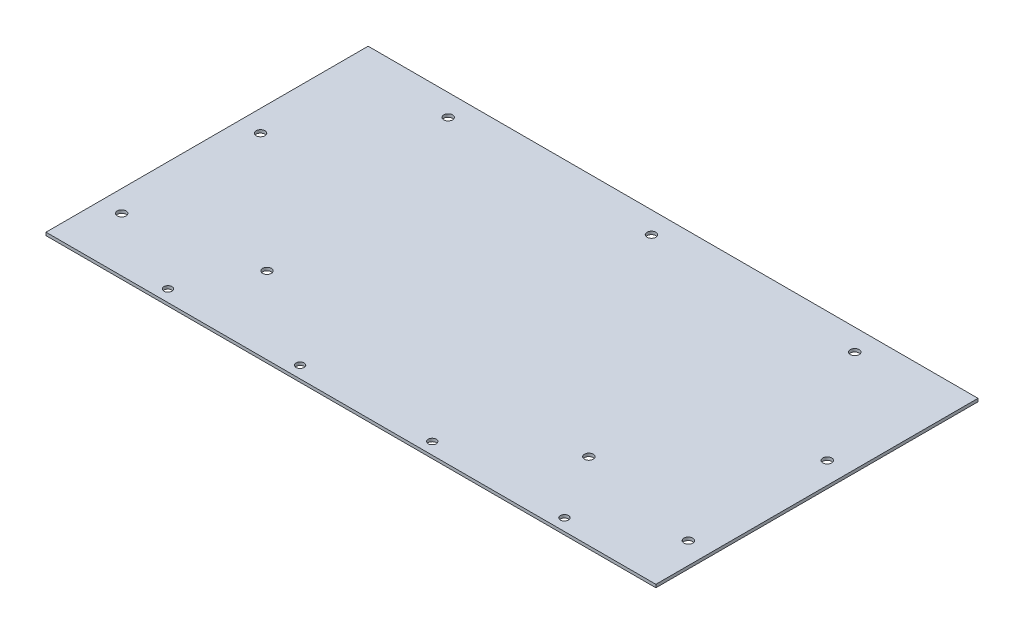
ISO-10303-21;
HEADER;
FILE_DESCRIPTION(('STEP AP214'),'2;1');
FILE_NAME('part.step','',(''),(''),'','','');
FILE_SCHEMA(('AUTOMOTIVE_DESIGN { 1 0 10303 214 1 1 1 1 }'));
ENDSEC;
DATA;
#1=APPLICATION_CONTEXT('core data for automotive mechanical design processes');
#2=APPLICATION_PROTOCOL_DEFINITION('international standard','automotive_design',2000,#1);
#3=PRODUCT_CONTEXT('',#1,'mechanical');
#4=PRODUCT('Part','Part','',(#3));
#5=PRODUCT_RELATED_PRODUCT_CATEGORY('part','',(#4));
#6=PRODUCT_DEFINITION_FORMATION('','',#4);
#7=PRODUCT_DEFINITION_CONTEXT('part definition',#1,'design');
#8=PRODUCT_DEFINITION('design','',#6,#7);
#9=PRODUCT_DEFINITION_SHAPE('','',#8);
#10=(LENGTH_UNIT() NAMED_UNIT(*) SI_UNIT(.MILLI.,.METRE.));
#11=(NAMED_UNIT(*) PLANE_ANGLE_UNIT() SI_UNIT($,.RADIAN.));
#12=(NAMED_UNIT(*) SI_UNIT($,.STERADIAN.) SOLID_ANGLE_UNIT());
#13=UNCERTAINTY_MEASURE_WITH_UNIT(LENGTH_MEASURE(1.E-05),#10,'distance_accuracy_value','');
#14=(GEOMETRIC_REPRESENTATION_CONTEXT(3) GLOBAL_UNCERTAINTY_ASSIGNED_CONTEXT((#13)) GLOBAL_UNIT_ASSIGNED_CONTEXT((#10,
#11,#12)) REPRESENTATION_CONTEXT('',''));
#15=CARTESIAN_POINT('',(0.,0.,0.));
#16=DIRECTION('',(0.,0.,1.));
#17=DIRECTION('',(1.,0.,0.));
#18=AXIS2_PLACEMENT_3D('',#15,#16,#17);
#19=CARTESIAN_POINT('',(-228.6,-1.143,238.315200026));
#20=DIRECTION('',(0.,1.,0.));
#21=DIRECTION('',(0.,0.,1.));
#22=AXIS2_PLACEMENT_3D('',#19,#20,#21);
#23=PLANE('',#22);
#24=CARTESIAN_POINT('',(1.39115855297923E-12,-1.143,13.0175));
#25=DIRECTION('',(0.,-1.,0.));
#26=DIRECTION('',(0.,0.,-1.));
#27=AXIS2_PLACEMENT_3D('',#24,#25,#26);
#28=CIRCLE('',#27,3.3);
#29=CARTESIAN_POINT('',(1.39115855297923E-12,-1.143,9.71749999999999));
#30=VERTEX_POINT('',#29);
#31=EDGE_CURVE('E227',#30,#30,#28,.T.);
#32=ORIENTED_EDGE('',*,*,#31,.F.);
#33=EDGE_LOOP('',(#32));
#34=FACE_BOUND('',#33,.T.);
#35=CARTESIAN_POINT('',(152.400000000001,-1.143,13.0175));
#36=DIRECTION('',(0.,-1.,0.));
#37=DIRECTION('',(0.,0.,-1.));
#38=AXIS2_PLACEMENT_3D('',#35,#36,#37);
#39=CIRCLE('',#38,3.3);
#40=CARTESIAN_POINT('',(152.400000000001,-1.143,9.7175));
#41=VERTEX_POINT('',#40);
#42=EDGE_CURVE('E233',#41,#41,#39,.T.);
#43=ORIENTED_EDGE('',*,*,#42,.F.);
#44=EDGE_LOOP('',(#43));
#45=FACE_BOUND('',#44,.T.);
#46=CARTESIAN_POINT('',(212.419,-1.143,197.784793717392));
#47=DIRECTION('',(0.,-1.,0.));
#48=DIRECTION('',(0.,0.,-1.));
#49=AXIS2_PLACEMENT_3D('',#46,#47,#48);
#50=CIRCLE('',#49,3.3);
#51=CARTESIAN_POINT('',(212.419,-1.143,194.484793717392));
#52=VERTEX_POINT('',#51);
#53=EDGE_CURVE('E245',#52,#52,#50,.T.);
#54=ORIENTED_EDGE('',*,*,#53,.F.);
#55=EDGE_LOOP('',(#54));
#56=FACE_BOUND('',#55,.T.);
#57=CARTESIAN_POINT('',(120.65,-1.143,180.586));
#58=DIRECTION('',(0.,-1.,0.));
#59=DIRECTION('',(0.,0.,-1.));
#60=AXIS2_PLACEMENT_3D('',#57,#58,#59);
#61=CIRCLE('',#60,3.3);
#62=CARTESIAN_POINT('',(120.65,-1.143,177.286));
#63=VERTEX_POINT('',#62);
#64=EDGE_CURVE('E251',#63,#63,#61,.T.);
#65=ORIENTED_EDGE('',*,*,#64,.F.);
#66=EDGE_LOOP('',(#65));
#67=FACE_BOUND('',#66,.T.);
#68=CARTESIAN_POINT('',(-212.419,-1.143,197.784793717392));
#69=DIRECTION('',(0.,-1.,0.));
#70=DIRECTION('',(0.,0.,-1.));
#71=AXIS2_PLACEMENT_3D('',#68,#69,#70);
#72=CIRCLE('',#71,3.3);
#73=CARTESIAN_POINT('',(-212.419,-1.143,194.484793717392));
#74=VERTEX_POINT('',#73);
#75=EDGE_CURVE('E263',#74,#74,#72,.T.);
#76=ORIENTED_EDGE('',*,*,#75,.F.);
#77=EDGE_LOOP('',(#76));
#78=FACE_BOUND('',#77,.T.);
#79=CARTESIAN_POINT('',(-46.99,-1.143,229.425200026));
#80=DIRECTION('',(0.,1.,0.));
#81=DIRECTION('',(0.,0.,1.));
#82=AXIS2_PLACEMENT_3D('',#79,#80,#81);
#83=CIRCLE('',#82,2.99999999999999);
#84=CARTESIAN_POINT('',(-46.99,-1.143,232.425200026));
#85=VERTEX_POINT('',#84);
#86=EDGE_CURVE('E271',#85,#85,#83,.T.);
#87=ORIENTED_EDGE('',*,*,#86,.T.);
#88=EDGE_LOOP('',(#87));
#89=FACE_BOUND('',#88,.T.);
#90=CARTESIAN_POINT('',(-146.05,-1.143,229.425200026));
#91=DIRECTION('',(0.,1.,0.));
#92=DIRECTION('',(0.,0.,1.));
#93=AXIS2_PLACEMENT_3D('',#90,#91,#92);
#94=CIRCLE('',#93,2.99999999999999);
#95=CARTESIAN_POINT('',(-146.05,-1.143,232.425200026));
#96=VERTEX_POINT('',#95);
#97=EDGE_CURVE('E110',#96,#96,#94,.T.);
#98=ORIENTED_EDGE('',*,*,#97,.T.);
#99=EDGE_LOOP('',(#98));
#100=FACE_BOUND('',#99,.T.);
#101=DIRECTION('',(0.,0.,-1.));
#102=VECTOR('',#101,1.);
#103=CARTESIAN_POINT('',(-228.6,-1.143,238.315200026));
#104=LINE('',#103,#102);
#105=CARTESIAN_POINT('',(-228.6,-1.143,238.315200026));
#106=VERTEX_POINT('',#105);
#107=CARTESIAN_POINT('',(-228.6,-1.143,-3.175));
#108=VERTEX_POINT('',#107);
#109=EDGE_CURVE('E126',#106,#108,#104,.T.);
#110=ORIENTED_EDGE('',*,*,#109,.T.);
#111=DIRECTION('',(-1.,0.,0.));
#112=VECTOR('',#111,1.);
#113=CARTESIAN_POINT('',(0.,-1.143,-3.175));
#114=LINE('',#113,#112);
#115=CARTESIAN_POINT('',(228.6,-1.143,-3.175));
#116=VERTEX_POINT('',#115);
#117=EDGE_CURVE('E104',#116,#108,#114,.T.);
#118=ORIENTED_EDGE('',*,*,#117,.F.);
#119=DIRECTION('',(0.,0.,-1.));
#120=VECTOR('',#119,1.);
#121=CARTESIAN_POINT('',(228.6,-1.143,238.315200026));
#122=LINE('',#121,#120);
#123=CARTESIAN_POINT('',(228.6,-1.143,238.315200026));
#124=VERTEX_POINT('',#123);
#125=EDGE_CURVE('E100',#124,#116,#122,.T.);
#126=ORIENTED_EDGE('',*,*,#125,.F.);
#127=DIRECTION('',(1.,0.,0.));
#128=VECTOR('',#127,1.);
#129=CARTESIAN_POINT('',(-228.6,-1.143,238.315200026));
#130=LINE('',#129,#128);
#131=EDGE_CURVE('E58',#106,#124,#130,.T.);
#132=ORIENTED_EDGE('',*,*,#131,.F.);
#133=EDGE_LOOP('',(#110,#118,#126,#132));
#134=FACE_BOUND('',#133,.T.);
#135=CARTESIAN_POINT('',(52.07,-1.143,229.425200026));
#136=DIRECTION('',(0.,1.,0.));
#137=DIRECTION('',(0.,0.,1.));
#138=AXIS2_PLACEMENT_3D('',#135,#136,#137);
#139=CIRCLE('',#138,2.99999999999999);
#140=CARTESIAN_POINT('',(52.07,-1.143,232.425200026));
#141=VERTEX_POINT('',#140);
#142=EDGE_CURVE('E131',#141,#141,#139,.T.);
#143=ORIENTED_EDGE('',*,*,#142,.T.);
#144=EDGE_LOOP('',(#143));
#145=FACE_BOUND('',#144,.T.);
#146=CARTESIAN_POINT('',(151.13,-1.143,229.425200026));
#147=DIRECTION('',(0.,1.,0.));
#148=DIRECTION('',(0.,0.,1.));
#149=AXIS2_PLACEMENT_3D('',#146,#147,#148);
#150=CIRCLE('',#149,2.99999999999999);
#151=CARTESIAN_POINT('',(151.13,-1.143,232.425200026));
#152=VERTEX_POINT('',#151);
#153=EDGE_CURVE('E11',#152,#152,#150,.T.);
#154=ORIENTED_EDGE('',*,*,#153,.T.);
#155=EDGE_LOOP('',(#154));
#156=FACE_BOUND('',#155,.T.);
#157=CARTESIAN_POINT('',(-120.65,-1.143,180.586));
#158=DIRECTION('',(0.,-1.,0.));
#159=DIRECTION('',(0.,0.,-1.));
#160=AXIS2_PLACEMENT_3D('',#157,#158,#159);
#161=CIRCLE('',#160,3.3);
#162=CARTESIAN_POINT('',(-120.65,-1.143,177.286));
#163=VERTEX_POINT('',#162);
#164=EDGE_CURVE('E257',#163,#163,#161,.T.);
#165=ORIENTED_EDGE('',*,*,#164,.F.);
#166=EDGE_LOOP('',(#165));
#167=FACE_BOUND('',#166,.T.);
#168=CARTESIAN_POINT('',(212.419,-1.143,93.6447937173916));
#169=DIRECTION('',(0.,-1.,0.));
#170=DIRECTION('',(0.,0.,-1.));
#171=AXIS2_PLACEMENT_3D('',#168,#169,#170);
#172=CIRCLE('',#171,3.3);
#173=CARTESIAN_POINT('',(212.419,-1.143,90.3447937173916));
#174=VERTEX_POINT('',#173);
#175=EDGE_CURVE('E239',#174,#174,#172,.T.);
#176=ORIENTED_EDGE('',*,*,#175,.F.);
#177=EDGE_LOOP('',(#176));
#178=FACE_BOUND('',#177,.T.);
#179=CARTESIAN_POINT('',(-152.399999999999,-1.143,13.0175));
#180=DIRECTION('',(0.,-1.,0.));
#181=DIRECTION('',(0.,0.,-1.));
#182=AXIS2_PLACEMENT_3D('',#179,#180,#181);
#183=CIRCLE('',#182,3.3);
#184=CARTESIAN_POINT('',(-152.399999999999,-1.143,9.7175));
#185=VERTEX_POINT('',#184);
#186=EDGE_CURVE('E219',#185,#185,#183,.T.);
#187=ORIENTED_EDGE('',*,*,#186,.F.);
#188=EDGE_LOOP('',(#187));
#189=FACE_BOUND('',#188,.T.);
#190=CARTESIAN_POINT('',(-212.419,-1.143,93.6447937173916));
#191=DIRECTION('',(0.,-1.,0.));
#192=DIRECTION('',(0.,0.,-1.));
#193=AXIS2_PLACEMENT_3D('',#190,#191,#192);
#194=CIRCLE('',#193,3.3);
#195=CARTESIAN_POINT('',(-212.419,-1.143,90.3447937173916));
#196=VERTEX_POINT('',#195);
#197=EDGE_CURVE('E216',#196,#196,#194,.T.);
#198=ORIENTED_EDGE('',*,*,#197,.F.);
#199=EDGE_LOOP('',(#198));
#200=FACE_BOUND('',#199,.T.);
#201=ADVANCED_FACE('F43',(#34,#45,#56,#67,#78,#89,#100,#134,#145,#156,#167,#178,#189,#200),#23,.F.);
#202=CARTESIAN_POINT('',(151.13,-1.397,229.425200026));
#203=DIRECTION('',(0.,1.,0.));
#204=DIRECTION('',(0.,0.,1.));
#205=AXIS2_PLACEMENT_3D('',#202,#203,#204);
#206=CYLINDRICAL_SURFACE('',#205,2.99999999999999);
#207=CARTESIAN_POINT('',(151.13,1.143,229.425200026));
#208=DIRECTION('',(0.,1.,0.));
#209=DIRECTION('',(0.,0.,1.));
#210=AXIS2_PLACEMENT_3D('',#207,#208,#209);
#211=CIRCLE('',#210,2.99999999999999);
#212=CARTESIAN_POINT('',(151.13,1.143,232.425200026));
#213=VERTEX_POINT('',#212);
#214=EDGE_CURVE('E51',#213,#213,#211,.T.);
#215=ORIENTED_EDGE('',*,*,#214,.T.);
#216=EDGE_LOOP('',(#215));
#217=FACE_BOUND('',#216,.T.);
#218=ORIENTED_EDGE('',*,*,#153,.F.);
#219=EDGE_LOOP('',(#218));
#220=FACE_BOUND('',#219,.T.);
#221=ADVANCED_FACE('F45',(#217,#220),#206,.F.);
#222=CARTESIAN_POINT('',(52.07,-1.397,229.425200026));
#223=DIRECTION('',(0.,1.,0.));
#224=DIRECTION('',(0.,0.,1.));
#225=AXIS2_PLACEMENT_3D('',#222,#223,#224);
#226=CYLINDRICAL_SURFACE('',#225,2.99999999999999);
#227=CARTESIAN_POINT('',(52.07,1.143,229.425200026));
#228=DIRECTION('',(0.,1.,0.));
#229=DIRECTION('',(0.,0.,1.));
#230=AXIS2_PLACEMENT_3D('',#227,#228,#229);
#231=CIRCLE('',#230,2.99999999999999);
#232=CARTESIAN_POINT('',(52.07,1.143,232.425200026));
#233=VERTEX_POINT('',#232);
#234=EDGE_CURVE('E94',#233,#233,#231,.T.);
#235=ORIENTED_EDGE('',*,*,#234,.T.);
#236=EDGE_LOOP('',(#235));
#237=FACE_BOUND('',#236,.T.);
#238=ORIENTED_EDGE('',*,*,#142,.F.);
#239=EDGE_LOOP('',(#238));
#240=FACE_BOUND('',#239,.T.);
#241=ADVANCED_FACE('F151',(#237,#240),#226,.F.);
#242=CARTESIAN_POINT('',(228.6,-1.143,238.315200026));
#243=DIRECTION('',(-1.,0.,0.));
#244=DIRECTION('',(0.,0.,1.));
#245=AXIS2_PLACEMENT_3D('',#242,#243,#244);
#246=PLANE('',#245);
#247=ORIENTED_EDGE('',*,*,#125,.T.);
#248=DIRECTION('',(0.,-1.,0.));
#249=VECTOR('',#248,1.);
#250=CARTESIAN_POINT('',(228.6,0.,-3.175));
#251=LINE('',#250,#249);
#252=CARTESIAN_POINT('',(228.6,1.143,-3.175));
#253=VERTEX_POINT('',#252);
#254=EDGE_CURVE('E98',#253,#116,#251,.T.);
#255=ORIENTED_EDGE('',*,*,#254,.F.);
#256=DIRECTION('',(0.,0.,-1.));
#257=VECTOR('',#256,1.);
#258=CARTESIAN_POINT('',(228.6,1.143,238.315200026));
#259=LINE('',#258,#257);
#260=CARTESIAN_POINT('',(228.6,1.143,238.315200026));
#261=VERTEX_POINT('',#260);
#262=EDGE_CURVE('E84',#261,#253,#259,.T.);
#263=ORIENTED_EDGE('',*,*,#262,.F.);
#264=DIRECTION('',(0.,1.,0.));
#265=VECTOR('',#264,1.);
#266=CARTESIAN_POINT('',(228.6,-1.143,238.315200026));
#267=LINE('',#266,#265);
#268=EDGE_CURVE('E120',#124,#261,#267,.T.);
#269=ORIENTED_EDGE('',*,*,#268,.F.);
#270=EDGE_LOOP('',(#247,#255,#263,#269));
#271=FACE_BOUND('',#270,.T.);
#272=ADVANCED_FACE('F99',(#271),#246,.F.);
#273=CARTESIAN_POINT('',(-228.6,1.143,238.315200026));
#274=DIRECTION('',(0.,-1.,0.));
#275=DIRECTION('',(0.,0.,-1.));
#276=AXIS2_PLACEMENT_3D('',#273,#274,#275);
#277=PLANE('',#276);
#278=CARTESIAN_POINT('',(-212.419,1.143,93.6447937173916));
#279=DIRECTION('',(0.,-1.,0.));
#280=DIRECTION('',(0.,0.,-1.));
#281=AXIS2_PLACEMENT_3D('',#278,#279,#280);
#282=CIRCLE('',#281,3.3);
#283=CARTESIAN_POINT('',(-212.419,1.143,90.3447937173916));
#284=VERTEX_POINT('',#283);
#285=EDGE_CURVE('E213',#284,#284,#282,.T.);
#286=ORIENTED_EDGE('',*,*,#285,.T.);
#287=EDGE_LOOP('',(#286));
#288=FACE_BOUND('',#287,.T.);
#289=CARTESIAN_POINT('',(-152.399999999999,1.143,13.0175));
#290=DIRECTION('',(0.,-1.,0.));
#291=DIRECTION('',(0.,0.,-1.));
#292=AXIS2_PLACEMENT_3D('',#289,#290,#291);
#293=CIRCLE('',#292,3.3);
#294=CARTESIAN_POINT('',(-152.399999999999,1.143,9.7175));
#295=VERTEX_POINT('',#294);
#296=EDGE_CURVE('E224',#295,#295,#293,.T.);
#297=ORIENTED_EDGE('',*,*,#296,.T.);
#298=EDGE_LOOP('',(#297));
#299=FACE_BOUND('',#298,.T.);
#300=CARTESIAN_POINT('',(1.39115855297923E-12,1.143,13.0175));
#301=DIRECTION('',(0.,-1.,0.));
#302=DIRECTION('',(0.,0.,-1.));
#303=AXIS2_PLACEMENT_3D('',#300,#301,#302);
#304=CIRCLE('',#303,3.3);
#305=CARTESIAN_POINT('',(1.39115855297923E-12,1.143,9.71749999999999));
#306=VERTEX_POINT('',#305);
#307=EDGE_CURVE('E230',#306,#306,#304,.T.);
#308=ORIENTED_EDGE('',*,*,#307,.T.);
#309=EDGE_LOOP('',(#308));
#310=FACE_BOUND('',#309,.T.);
#311=CARTESIAN_POINT('',(152.400000000001,1.143,13.0175));
#312=DIRECTION('',(0.,-1.,0.));
#313=DIRECTION('',(0.,0.,-1.));
#314=AXIS2_PLACEMENT_3D('',#311,#312,#313);
#315=CIRCLE('',#314,3.3);
#316=CARTESIAN_POINT('',(152.400000000001,1.143,9.7175));
#317=VERTEX_POINT('',#316);
#318=EDGE_CURVE('E236',#317,#317,#315,.T.);
#319=ORIENTED_EDGE('',*,*,#318,.T.);
#320=EDGE_LOOP('',(#319));
#321=FACE_BOUND('',#320,.T.);
#322=CARTESIAN_POINT('',(212.419,1.143,93.6447937173916));
#323=DIRECTION('',(0.,-1.,0.));
#324=DIRECTION('',(0.,0.,-1.));
#325=AXIS2_PLACEMENT_3D('',#322,#323,#324);
#326=CIRCLE('',#325,3.3);
#327=CARTESIAN_POINT('',(212.419,1.143,90.3447937173916));
#328=VERTEX_POINT('',#327);
#329=EDGE_CURVE('E242',#328,#328,#326,.T.);
#330=ORIENTED_EDGE('',*,*,#329,.T.);
#331=EDGE_LOOP('',(#330));
#332=FACE_BOUND('',#331,.T.);
#333=CARTESIAN_POINT('',(212.419,1.143,197.784793717392));
#334=DIRECTION('',(0.,-1.,0.));
#335=DIRECTION('',(0.,0.,-1.));
#336=AXIS2_PLACEMENT_3D('',#333,#334,#335);
#337=CIRCLE('',#336,3.3);
#338=CARTESIAN_POINT('',(212.419,1.143,194.484793717392));
#339=VERTEX_POINT('',#338);
#340=EDGE_CURVE('E248',#339,#339,#337,.T.);
#341=ORIENTED_EDGE('',*,*,#340,.T.);
#342=EDGE_LOOP('',(#341));
#343=FACE_BOUND('',#342,.T.);
#344=CARTESIAN_POINT('',(120.65,1.143,180.586));
#345=DIRECTION('',(0.,-1.,0.));
#346=DIRECTION('',(0.,0.,-1.));
#347=AXIS2_PLACEMENT_3D('',#344,#345,#346);
#348=CIRCLE('',#347,3.3);
#349=CARTESIAN_POINT('',(120.65,1.143,177.286));
#350=VERTEX_POINT('',#349);
#351=EDGE_CURVE('E254',#350,#350,#348,.T.);
#352=ORIENTED_EDGE('',*,*,#351,.T.);
#353=EDGE_LOOP('',(#352));
#354=FACE_BOUND('',#353,.T.);
#355=CARTESIAN_POINT('',(-120.65,1.143,180.586));
#356=DIRECTION('',(0.,-1.,0.));
#357=DIRECTION('',(0.,0.,-1.));
#358=AXIS2_PLACEMENT_3D('',#355,#356,#357);
#359=CIRCLE('',#358,3.3);
#360=CARTESIAN_POINT('',(-120.65,1.143,177.286));
#361=VERTEX_POINT('',#360);
#362=EDGE_CURVE('E260',#361,#361,#359,.T.);
#363=ORIENTED_EDGE('',*,*,#362,.T.);
#364=EDGE_LOOP('',(#363));
#365=FACE_BOUND('',#364,.T.);
#366=CARTESIAN_POINT('',(-212.419,1.143,197.784793717392));
#367=DIRECTION('',(0.,-1.,0.));
#368=DIRECTION('',(0.,0.,-1.));
#369=AXIS2_PLACEMENT_3D('',#366,#367,#368);
#370=CIRCLE('',#369,3.3);
#371=CARTESIAN_POINT('',(-212.419,1.143,194.484793717392));
#372=VERTEX_POINT('',#371);
#373=EDGE_CURVE('E266',#372,#372,#370,.T.);
#374=ORIENTED_EDGE('',*,*,#373,.T.);
#375=EDGE_LOOP('',(#374));
#376=FACE_BOUND('',#375,.T.);
#377=CARTESIAN_POINT('',(-46.99,1.143,229.425200026));
#378=DIRECTION('',(0.,1.,0.));
#379=DIRECTION('',(0.,0.,1.));
#380=AXIS2_PLACEMENT_3D('',#377,#378,#379);
#381=CIRCLE('',#380,2.99999999999999);
#382=CARTESIAN_POINT('',(-46.99,1.143,232.425200026));
#383=VERTEX_POINT('',#382);
#384=EDGE_CURVE('E269',#383,#383,#381,.T.);
#385=ORIENTED_EDGE('',*,*,#384,.F.);
#386=EDGE_LOOP('',(#385));
#387=FACE_BOUND('',#386,.T.);
#388=CARTESIAN_POINT('',(-146.05,1.143,229.425200026));
#389=DIRECTION('',(0.,1.,0.));
#390=DIRECTION('',(0.,0.,1.));
#391=AXIS2_PLACEMENT_3D('',#388,#389,#390);
#392=CIRCLE('',#391,2.99999999999999);
#393=CARTESIAN_POINT('',(-146.05,1.143,232.425200026));
#394=VERTEX_POINT('',#393);
#395=EDGE_CURVE('E113',#394,#394,#392,.T.);
#396=ORIENTED_EDGE('',*,*,#395,.F.);
#397=EDGE_LOOP('',(#396));
#398=FACE_BOUND('',#397,.T.);
#399=ORIENTED_EDGE('',*,*,#262,.T.);
#400=DIRECTION('',(1.,0.,0.));
#401=VECTOR('',#400,1.);
#402=CARTESIAN_POINT('',(0.,1.143,-3.175));
#403=LINE('',#402,#401);
#404=CARTESIAN_POINT('',(-228.6,1.143,-3.175));
#405=VERTEX_POINT('',#404);
#406=EDGE_CURVE('E90',#405,#253,#403,.T.);
#407=ORIENTED_EDGE('',*,*,#406,.F.);
#408=DIRECTION('',(0.,0.,-1.));
#409=VECTOR('',#408,1.);
#410=CARTESIAN_POINT('',(-228.6,1.143,238.315200026));
#411=LINE('',#410,#409);
#412=CARTESIAN_POINT('',(-228.6,1.143,238.315200026));
#413=VERTEX_POINT('',#412);
#414=EDGE_CURVE('E95',#413,#405,#411,.T.);
#415=ORIENTED_EDGE('',*,*,#414,.F.);
#416=DIRECTION('',(-1.,0.,0.));
#417=VECTOR('',#416,1.);
#418=CARTESIAN_POINT('',(-228.6,1.143,238.315200026));
#419=LINE('',#418,#417);
#420=EDGE_CURVE('E91',#261,#413,#419,.T.);
#421=ORIENTED_EDGE('',*,*,#420,.F.);
#422=EDGE_LOOP('',(#399,#407,#415,#421));
#423=FACE_BOUND('',#422,.T.);
#424=ORIENTED_EDGE('',*,*,#234,.F.);
#425=EDGE_LOOP('',(#424));
#426=FACE_BOUND('',#425,.T.);
#427=ORIENTED_EDGE('',*,*,#214,.F.);
#428=EDGE_LOOP('',(#427));
#429=FACE_BOUND('',#428,.T.);
#430=ADVANCED_FACE('F86',(#288,#299,#310,#321,#332,#343,#354,#365,#376,#387,#398,#423,#426,
#429),#277,.F.);
#431=CARTESIAN_POINT('',(-228.6,-1.143,238.315200026));
#432=DIRECTION('',(1.,0.,0.));
#433=DIRECTION('',(0.,0.,-1.));
#434=AXIS2_PLACEMENT_3D('',#431,#432,#433);
#435=PLANE('',#434);
#436=ORIENTED_EDGE('',*,*,#414,.T.);
#437=DIRECTION('',(0.,1.,0.));
#438=VECTOR('',#437,1.);
#439=CARTESIAN_POINT('',(-228.6,0.,-3.175));
#440=LINE('',#439,#438);
#441=EDGE_CURVE('E109',#108,#405,#440,.T.);
#442=ORIENTED_EDGE('',*,*,#441,.F.);
#443=ORIENTED_EDGE('',*,*,#109,.F.);
#444=DIRECTION('',(0.,-1.,0.));
#445=VECTOR('',#444,1.);
#446=CARTESIAN_POINT('',(-228.6,-1.143,238.315200026));
#447=LINE('',#446,#445);
#448=EDGE_CURVE('E63',#413,#106,#447,.T.);
#449=ORIENTED_EDGE('',*,*,#448,.F.);
#450=EDGE_LOOP('',(#436,#442,#443,#449));
#451=FACE_BOUND('',#450,.T.);
#452=ADVANCED_FACE('F139',(#451),#435,.F.);
#453=CARTESIAN_POINT('',(0.,0.,238.315200026));
#454=DIRECTION('',(0.,0.,-1.));
#455=DIRECTION('',(-1.,0.,0.));
#456=AXIS2_PLACEMENT_3D('',#453,#454,#455);
#457=PLANE('',#456);
#458=ORIENTED_EDGE('',*,*,#268,.T.);
#459=ORIENTED_EDGE('',*,*,#420,.T.);
#460=ORIENTED_EDGE('',*,*,#448,.T.);
#461=ORIENTED_EDGE('',*,*,#131,.T.);
#462=EDGE_LOOP('',(#458,#459,#460,#461));
#463=FACE_BOUND('',#462,.T.);
#464=ADVANCED_FACE('F147',(#463),#457,.F.);
#465=CARTESIAN_POINT('',(0.,0.,-3.175));
#466=DIRECTION('',(0.,0.,-1.));
#467=DIRECTION('',(-1.,0.,0.));
#468=AXIS2_PLACEMENT_3D('',#465,#466,#467);
#469=PLANE('',#468);
#470=ORIENTED_EDGE('',*,*,#406,.T.);
#471=ORIENTED_EDGE('',*,*,#254,.T.);
#472=ORIENTED_EDGE('',*,*,#117,.T.);
#473=ORIENTED_EDGE('',*,*,#441,.T.);
#474=EDGE_LOOP('',(#470,#471,#472,#473));
#475=FACE_BOUND('',#474,.T.);
#476=ADVANCED_FACE('F107',(#475),#469,.T.);
#477=CARTESIAN_POINT('',(-146.05,-1.397,229.425200026));
#478=DIRECTION('',(0.,1.,0.));
#479=DIRECTION('',(0.,0.,1.));
#480=AXIS2_PLACEMENT_3D('',#477,#478,#479);
#481=CYLINDRICAL_SURFACE('',#480,2.99999999999999);
#482=ORIENTED_EDGE('',*,*,#395,.T.);
#483=EDGE_LOOP('',(#482));
#484=FACE_BOUND('',#483,.T.);
#485=ORIENTED_EDGE('',*,*,#97,.F.);
#486=EDGE_LOOP('',(#485));
#487=FACE_BOUND('',#486,.T.);
#488=ADVANCED_FACE('F168',(#484,#487),#481,.F.);
#489=CARTESIAN_POINT('',(-46.99,-1.397,229.425200026));
#490=DIRECTION('',(0.,1.,0.));
#491=DIRECTION('',(0.,0.,1.));
#492=AXIS2_PLACEMENT_3D('',#489,#490,#491);
#493=CYLINDRICAL_SURFACE('',#492,2.99999999999999);
#494=ORIENTED_EDGE('',*,*,#384,.T.);
#495=EDGE_LOOP('',(#494));
#496=FACE_BOUND('',#495,.T.);
#497=ORIENTED_EDGE('',*,*,#86,.F.);
#498=EDGE_LOOP('',(#497));
#499=FACE_BOUND('',#498,.T.);
#500=ADVANCED_FACE('F171',(#496,#499),#493,.F.);
#501=CARTESIAN_POINT('',(-212.419,-1.143,197.784793717392));
#502=DIRECTION('',(0.,-1.,0.));
#503=DIRECTION('',(0.,0.,-1.));
#504=AXIS2_PLACEMENT_3D('',#501,#502,#503);
#505=CYLINDRICAL_SURFACE('',#504,3.3);
#506=ORIENTED_EDGE('',*,*,#373,.F.);
#507=EDGE_LOOP('',(#506));
#508=FACE_BOUND('',#507,.T.);
#509=ORIENTED_EDGE('',*,*,#75,.T.);
#510=EDGE_LOOP('',(#509));
#511=FACE_BOUND('',#510,.T.);
#512=ADVANCED_FACE('F174',(#508,#511),#505,.F.);
#513=CARTESIAN_POINT('',(-120.65,-1.143,180.586));
#514=DIRECTION('',(0.,-1.,0.));
#515=DIRECTION('',(0.,0.,-1.));
#516=AXIS2_PLACEMENT_3D('',#513,#514,#515);
#517=CYLINDRICAL_SURFACE('',#516,3.3);
#518=ORIENTED_EDGE('',*,*,#362,.F.);
#519=EDGE_LOOP('',(#518));
#520=FACE_BOUND('',#519,.T.);
#521=ORIENTED_EDGE('',*,*,#164,.T.);
#522=EDGE_LOOP('',(#521));
#523=FACE_BOUND('',#522,.T.);
#524=ADVANCED_FACE('F177',(#520,#523),#517,.F.);
#525=CARTESIAN_POINT('',(120.65,-1.143,180.586));
#526=DIRECTION('',(0.,-1.,0.));
#527=DIRECTION('',(0.,0.,-1.));
#528=AXIS2_PLACEMENT_3D('',#525,#526,#527);
#529=CYLINDRICAL_SURFACE('',#528,3.3);
#530=ORIENTED_EDGE('',*,*,#351,.F.);
#531=EDGE_LOOP('',(#530));
#532=FACE_BOUND('',#531,.T.);
#533=ORIENTED_EDGE('',*,*,#64,.T.);
#534=EDGE_LOOP('',(#533));
#535=FACE_BOUND('',#534,.T.);
#536=ADVANCED_FACE('F181',(#532,#535),#529,.F.);
#537=CARTESIAN_POINT('',(212.419,-1.143,197.784793717392));
#538=DIRECTION('',(0.,-1.,0.));
#539=DIRECTION('',(0.,0.,-1.));
#540=AXIS2_PLACEMENT_3D('',#537,#538,#539);
#541=CYLINDRICAL_SURFACE('',#540,3.3);
#542=ORIENTED_EDGE('',*,*,#340,.F.);
#543=EDGE_LOOP('',(#542));
#544=FACE_BOUND('',#543,.T.);
#545=ORIENTED_EDGE('',*,*,#53,.T.);
#546=EDGE_LOOP('',(#545));
#547=FACE_BOUND('',#546,.T.);
#548=ADVANCED_FACE('F185',(#544,#547),#541,.F.);
#549=CARTESIAN_POINT('',(212.419,-1.143,93.6447937173916));
#550=DIRECTION('',(0.,-1.,0.));
#551=DIRECTION('',(0.,0.,-1.));
#552=AXIS2_PLACEMENT_3D('',#549,#550,#551);
#553=CYLINDRICAL_SURFACE('',#552,3.3);
#554=ORIENTED_EDGE('',*,*,#329,.F.);
#555=EDGE_LOOP('',(#554));
#556=FACE_BOUND('',#555,.T.);
#557=ORIENTED_EDGE('',*,*,#175,.T.);
#558=EDGE_LOOP('',(#557));
#559=FACE_BOUND('',#558,.T.);
#560=ADVANCED_FACE('F189',(#556,#559),#553,.F.);
#561=CARTESIAN_POINT('',(152.400000000001,-1.143,13.0175));
#562=DIRECTION('',(0.,-1.,0.));
#563=DIRECTION('',(0.,0.,-1.));
#564=AXIS2_PLACEMENT_3D('',#561,#562,#563);
#565=CYLINDRICAL_SURFACE('',#564,3.3);
#566=ORIENTED_EDGE('',*,*,#318,.F.);
#567=EDGE_LOOP('',(#566));
#568=FACE_BOUND('',#567,.T.);
#569=ORIENTED_EDGE('',*,*,#42,.T.);
#570=EDGE_LOOP('',(#569));
#571=FACE_BOUND('',#570,.T.);
#572=ADVANCED_FACE('F193',(#568,#571),#565,.F.);
#573=CARTESIAN_POINT('',(1.39115855297923E-12,-1.143,13.0175));
#574=DIRECTION('',(0.,-1.,0.));
#575=DIRECTION('',(0.,0.,-1.));
#576=AXIS2_PLACEMENT_3D('',#573,#574,#575);
#577=CYLINDRICAL_SURFACE('',#576,3.3);
#578=ORIENTED_EDGE('',*,*,#307,.F.);
#579=EDGE_LOOP('',(#578));
#580=FACE_BOUND('',#579,.T.);
#581=ORIENTED_EDGE('',*,*,#31,.T.);
#582=EDGE_LOOP('',(#581));
#583=FACE_BOUND('',#582,.T.);
#584=ADVANCED_FACE('F197',(#580,#583),#577,.F.);
#585=CARTESIAN_POINT('',(-152.399999999999,-1.143,13.0175));
#586=DIRECTION('',(0.,-1.,0.));
#587=DIRECTION('',(0.,0.,-1.));
#588=AXIS2_PLACEMENT_3D('',#585,#586,#587);
#589=CYLINDRICAL_SURFACE('',#588,3.3);
#590=ORIENTED_EDGE('',*,*,#296,.F.);
#591=EDGE_LOOP('',(#590));
#592=FACE_BOUND('',#591,.T.);
#593=ORIENTED_EDGE('',*,*,#186,.T.);
#594=EDGE_LOOP('',(#593));
#595=FACE_BOUND('',#594,.T.);
#596=ADVANCED_FACE('F201',(#592,#595),#589,.F.);
#597=CARTESIAN_POINT('',(-212.419,-1.143,93.6447937173916));
#598=DIRECTION('',(0.,-1.,0.));
#599=DIRECTION('',(0.,0.,-1.));
#600=AXIS2_PLACEMENT_3D('',#597,#598,#599);
#601=CYLINDRICAL_SURFACE('',#600,3.3);
#602=ORIENTED_EDGE('',*,*,#285,.F.);
#603=EDGE_LOOP('',(#602));
#604=FACE_BOUND('',#603,.T.);
#605=ORIENTED_EDGE('',*,*,#197,.T.);
#606=EDGE_LOOP('',(#605));
#607=FACE_BOUND('',#606,.T.);
#608=ADVANCED_FACE('F205',(#604,#607),#601,.F.);
#609=CLOSED_SHELL('',(#201,#221,#241,#272,#430,#452,#464,#476,#488,#500,#512,#524,#536,#548,
#560,#572,#584,#596,#608));
#610=MANIFOLD_SOLID_BREP('B2',#609);
#611=ADVANCED_BREP_SHAPE_REPRESENTATION('',(#18,#610),#14);
#612=SHAPE_DEFINITION_REPRESENTATION(#9,#611);
ENDSEC;
END-ISO-10303-21;
